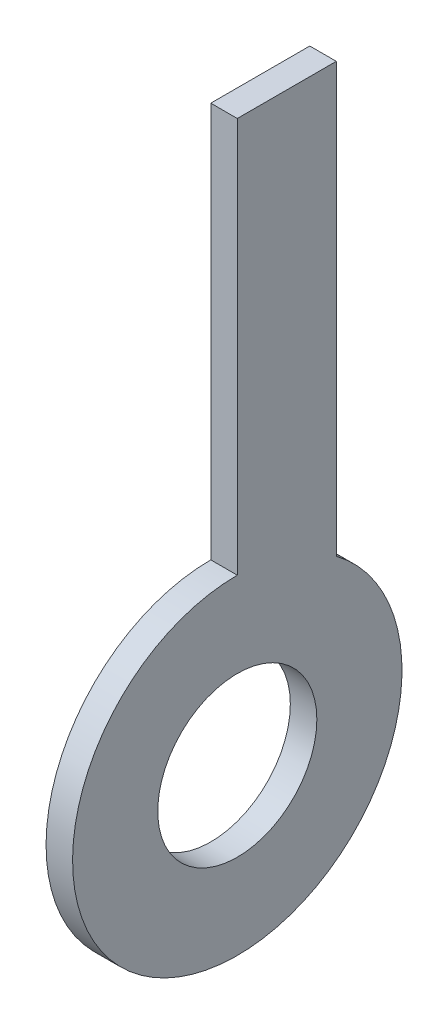
ISO-10303-21;
HEADER;
FILE_DESCRIPTION(('STEP AP214'),'2;1');
FILE_NAME('part.step','',(''),(''),'','','');
FILE_SCHEMA(('AUTOMOTIVE_DESIGN { 1 0 10303 214 1 1 1 1 }'));
ENDSEC;
DATA;
#1=APPLICATION_CONTEXT('core data for automotive mechanical design processes');
#2=APPLICATION_PROTOCOL_DEFINITION('international standard','automotive_design',2000,#1);
#3=PRODUCT_CONTEXT('',#1,'mechanical');
#4=PRODUCT('Part','Part','',(#3));
#5=PRODUCT_RELATED_PRODUCT_CATEGORY('part','',(#4));
#6=PRODUCT_DEFINITION_FORMATION('','',#4);
#7=PRODUCT_DEFINITION_CONTEXT('part definition',#1,'design');
#8=PRODUCT_DEFINITION('design','',#6,#7);
#9=PRODUCT_DEFINITION_SHAPE('','',#8);
#10=(LENGTH_UNIT() NAMED_UNIT(*) SI_UNIT(.MILLI.,.METRE.));
#11=(NAMED_UNIT(*) PLANE_ANGLE_UNIT() SI_UNIT($,.RADIAN.));
#12=(NAMED_UNIT(*) SI_UNIT($,.STERADIAN.) SOLID_ANGLE_UNIT());
#13=UNCERTAINTY_MEASURE_WITH_UNIT(LENGTH_MEASURE(1.E-05),#10,'distance_accuracy_value','');
#14=(GEOMETRIC_REPRESENTATION_CONTEXT(3) GLOBAL_UNCERTAINTY_ASSIGNED_CONTEXT((#13)) GLOBAL_UNIT_ASSIGNED_CONTEXT((#10,
#11,#12)) REPRESENTATION_CONTEXT('',''));
#15=CARTESIAN_POINT('',(0.,0.,0.));
#16=DIRECTION('',(0.,0.,1.));
#17=DIRECTION('',(1.,0.,0.));
#18=AXIS2_PLACEMENT_3D('',#15,#16,#17);
#19=CARTESIAN_POINT('',(2.,0.,0.));
#20=DIRECTION('',(1.,0.,0.));
#21=DIRECTION('',(0.,0.,-1.));
#22=AXIS2_PLACEMENT_3D('',#19,#20,#21);
#23=PLANE('',#22);
#24=CARTESIAN_POINT('',(2.,0.,0.));
#25=DIRECTION('',(1.,0.,0.));
#26=DIRECTION('',(0.,0.,-1.));
#27=AXIS2_PLACEMENT_3D('',#24,#25,#26);
#28=CIRCLE('',#27,12.4205541273248);
#29=CARTESIAN_POINT('',(2.,12.4205541273248,0.));
#30=VERTEX_POINT('',#29);
#31=CARTESIAN_POINT('',(2.,9.9260702286623,-7.46614322428051));
#32=VERTEX_POINT('',#31);
#33=EDGE_CURVE('E91',#30,#32,#28,.T.);
#34=ORIENTED_EDGE('',*,*,#33,.T.);
#35=DIRECTION('',(0.,1.,0.));
#36=VECTOR('',#35,1.);
#37=CARTESIAN_POINT('',(2.,42.2488898326349,-7.46614322428051));
#38=LINE('',#37,#36);
#39=CARTESIAN_POINT('',(2.,42.2488898326349,-7.46614322428051));
#40=VERTEX_POINT('',#39);
#41=EDGE_CURVE('E86',#32,#40,#38,.T.);
#42=ORIENTED_EDGE('',*,*,#41,.T.);
#43=DIRECTION('',(0.,0.,1.));
#44=VECTOR('',#43,1.);
#45=CARTESIAN_POINT('',(2.,42.2488898326349,0.));
#46=LINE('',#45,#44);
#47=CARTESIAN_POINT('',(2.,42.2488898326349,0.));
#48=VERTEX_POINT('',#47);
#49=EDGE_CURVE('E89',#40,#48,#46,.T.);
#50=ORIENTED_EDGE('',*,*,#49,.T.);
#51=DIRECTION('',(0.,-1.,0.));
#52=VECTOR('',#51,1.);
#53=CARTESIAN_POINT('',(2.,12.4205541273248,0.));
#54=LINE('',#53,#52);
#55=EDGE_CURVE('E56',#48,#30,#54,.T.);
#56=ORIENTED_EDGE('',*,*,#55,.T.);
#57=EDGE_LOOP('',(#34,#42,#50,#56));
#58=FACE_BOUND('',#57,.T.);
#59=CARTESIAN_POINT('',(2.,0.,0.));
#60=DIRECTION('',(1.,0.,0.));
#61=DIRECTION('',(0.,0.,-1.));
#62=AXIS2_PLACEMENT_3D('',#59,#60,#61);
#63=CIRCLE('',#62,6.);
#64=CARTESIAN_POINT('',(2.,0.,-6.));
#65=VERTEX_POINT('',#64);
#66=EDGE_CURVE('E106',#65,#65,#63,.T.);
#67=ORIENTED_EDGE('',*,*,#66,.F.);
#68=EDGE_LOOP('',(#67));
#69=FACE_BOUND('',#68,.T.);
#70=ADVANCED_FACE('F39',(#58,#69),#23,.T.);
#71=CARTESIAN_POINT('',(0.,0.,0.));
#72=DIRECTION('',(1.,0.,0.));
#73=DIRECTION('',(0.,0.,-1.));
#74=AXIS2_PLACEMENT_3D('',#71,#72,#73);
#75=PLANE('',#74);
#76=CARTESIAN_POINT('',(0.,0.,0.));
#77=DIRECTION('',(1.,0.,0.));
#78=DIRECTION('',(0.,0.,-1.));
#79=AXIS2_PLACEMENT_3D('',#76,#77,#78);
#80=CIRCLE('',#79,12.4205541273248);
#81=CARTESIAN_POINT('',(0.,12.4205541273248,0.));
#82=VERTEX_POINT('',#81);
#83=CARTESIAN_POINT('',(0.,9.9260702286623,-7.46614322428051));
#84=VERTEX_POINT('',#83);
#85=EDGE_CURVE('E103',#82,#84,#80,.T.);
#86=ORIENTED_EDGE('',*,*,#85,.F.);
#87=DIRECTION('',(0.,-1.,0.));
#88=VECTOR('',#87,1.);
#89=CARTESIAN_POINT('',(0.,12.4205541273248,0.));
#90=LINE('',#89,#88);
#91=CARTESIAN_POINT('',(0.,42.2488898326349,0.));
#92=VERTEX_POINT('',#91);
#93=EDGE_CURVE('E79',#92,#82,#90,.T.);
#94=ORIENTED_EDGE('',*,*,#93,.F.);
#95=DIRECTION('',(0.,0.,1.));
#96=VECTOR('',#95,1.);
#97=CARTESIAN_POINT('',(0.,42.2488898326349,0.));
#98=LINE('',#97,#96);
#99=CARTESIAN_POINT('',(0.,42.2488898326349,-7.46614322428051));
#100=VERTEX_POINT('',#99);
#101=EDGE_CURVE('E73',#100,#92,#98,.T.);
#102=ORIENTED_EDGE('',*,*,#101,.F.);
#103=DIRECTION('',(0.,1.,0.));
#104=VECTOR('',#103,1.);
#105=CARTESIAN_POINT('',(0.,42.2488898326349,-7.46614322428051));
#106=LINE('',#105,#104);
#107=EDGE_CURVE('E95',#84,#100,#106,.T.);
#108=ORIENTED_EDGE('',*,*,#107,.F.);
#109=EDGE_LOOP('',(#86,#94,#102,#108));
#110=FACE_BOUND('',#109,.T.);
#111=CARTESIAN_POINT('',(0.,0.,0.));
#112=DIRECTION('',(1.,0.,0.));
#113=DIRECTION('',(0.,0.,-1.));
#114=AXIS2_PLACEMENT_3D('',#111,#112,#113);
#115=CIRCLE('',#114,6.);
#116=CARTESIAN_POINT('',(0.,0.,-6.));
#117=VERTEX_POINT('',#116);
#118=EDGE_CURVE('E118',#117,#117,#115,.T.);
#119=ORIENTED_EDGE('',*,*,#118,.T.);
#120=EDGE_LOOP('',(#119));
#121=FACE_BOUND('',#120,.T.);
#122=ADVANCED_FACE('F114',(#110,#121),#75,.F.);
#123=CARTESIAN_POINT('',(2.,0.,0.));
#124=DIRECTION('',(-1.,0.,0.));
#125=DIRECTION('',(0.,0.,1.));
#126=AXIS2_PLACEMENT_3D('',#123,#124,#125);
#127=CYLINDRICAL_SURFACE('',#126,12.4205541273248);
#128=ORIENTED_EDGE('',*,*,#85,.T.);
#129=DIRECTION('',(-1.,0.,0.));
#130=VECTOR('',#129,1.);
#131=CARTESIAN_POINT('',(2.,9.9260702286623,-7.46614322428051));
#132=LINE('',#131,#130);
#133=EDGE_CURVE('E11',#32,#84,#132,.T.);
#134=ORIENTED_EDGE('',*,*,#133,.F.);
#135=ORIENTED_EDGE('',*,*,#33,.F.);
#136=DIRECTION('',(-1.,0.,0.));
#137=VECTOR('',#136,1.);
#138=CARTESIAN_POINT('',(2.,12.4205541273248,0.));
#139=LINE('',#138,#137);
#140=EDGE_CURVE('E99',#30,#82,#139,.T.);
#141=ORIENTED_EDGE('',*,*,#140,.T.);
#142=EDGE_LOOP('',(#128,#134,#135,#141));
#143=FACE_BOUND('',#142,.T.);
#144=ADVANCED_FACE('F41',(#143),#127,.T.);
#145=CARTESIAN_POINT('',(2.,42.2488898326349,-7.46614322428051));
#146=DIRECTION('',(0.,0.,1.));
#147=DIRECTION('',(1.,0.,0.));
#148=AXIS2_PLACEMENT_3D('',#145,#146,#147);
#149=PLANE('',#148);
#150=ORIENTED_EDGE('',*,*,#107,.T.);
#151=DIRECTION('',(-1.,0.,0.));
#152=VECTOR('',#151,1.);
#153=CARTESIAN_POINT('',(2.,42.2488898326349,-7.46614322428051));
#154=LINE('',#153,#152);
#155=EDGE_CURVE('E48',#40,#100,#154,.T.);
#156=ORIENTED_EDGE('',*,*,#155,.F.);
#157=ORIENTED_EDGE('',*,*,#41,.F.);
#158=ORIENTED_EDGE('',*,*,#133,.T.);
#159=EDGE_LOOP('',(#150,#156,#157,#158));
#160=FACE_BOUND('',#159,.T.);
#161=ADVANCED_FACE('F94',(#160),#149,.F.);
#162=CARTESIAN_POINT('',(2.,42.2488898326349,0.));
#163=DIRECTION('',(0.,-1.,0.));
#164=DIRECTION('',(0.,0.,-1.));
#165=AXIS2_PLACEMENT_3D('',#162,#163,#164);
#166=PLANE('',#165);
#167=ORIENTED_EDGE('',*,*,#101,.T.);
#168=DIRECTION('',(-1.,0.,0.));
#169=VECTOR('',#168,1.);
#170=CARTESIAN_POINT('',(2.,42.2488898326349,0.));
#171=LINE('',#170,#169);
#172=EDGE_CURVE('E96',#48,#92,#171,.T.);
#173=ORIENTED_EDGE('',*,*,#172,.F.);
#174=ORIENTED_EDGE('',*,*,#49,.F.);
#175=ORIENTED_EDGE('',*,*,#155,.T.);
#176=EDGE_LOOP('',(#167,#173,#174,#175));
#177=FACE_BOUND('',#176,.T.);
#178=ADVANCED_FACE('F97',(#177),#166,.F.);
#179=CARTESIAN_POINT('',(2.,12.4205541273248,0.));
#180=DIRECTION('',(0.,0.,-1.));
#181=DIRECTION('',(-1.,0.,0.));
#182=AXIS2_PLACEMENT_3D('',#179,#180,#181);
#183=PLANE('',#182);
#184=ORIENTED_EDGE('',*,*,#93,.T.);
#185=ORIENTED_EDGE('',*,*,#140,.F.);
#186=ORIENTED_EDGE('',*,*,#55,.F.);
#187=ORIENTED_EDGE('',*,*,#172,.T.);
#188=EDGE_LOOP('',(#184,#185,#186,#187));
#189=FACE_BOUND('',#188,.T.);
#190=ADVANCED_FACE('F111',(#189),#183,.F.);
#191=CARTESIAN_POINT('',(2.,0.,0.));
#192=DIRECTION('',(-1.,0.,0.));
#193=DIRECTION('',(0.,0.,1.));
#194=AXIS2_PLACEMENT_3D('',#191,#192,#193);
#195=CYLINDRICAL_SURFACE('',#194,6.);
#196=ORIENTED_EDGE('',*,*,#66,.T.);
#197=EDGE_LOOP('',(#196));
#198=FACE_BOUND('',#197,.T.);
#199=ORIENTED_EDGE('',*,*,#118,.F.);
#200=EDGE_LOOP('',(#199));
#201=FACE_BOUND('',#200,.T.);
#202=ADVANCED_FACE('F124',(#198,#201),#195,.F.);
#203=CLOSED_SHELL('',(#70,#122,#144,#161,#178,#190,#202));
#204=MANIFOLD_SOLID_BREP('B2',#203);
#205=ADVANCED_BREP_SHAPE_REPRESENTATION('',(#18,#204),#14);
#206=SHAPE_DEFINITION_REPRESENTATION(#9,#205);
ENDSEC;
END-ISO-10303-21;
